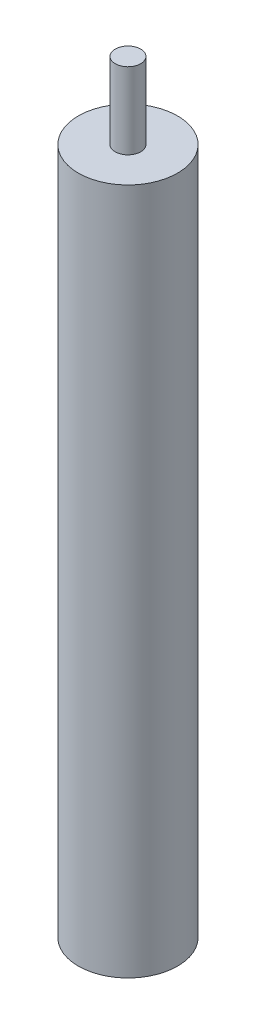
ISO-10303-21;
HEADER;
FILE_DESCRIPTION(('STEP AP214'),'2;1');
FILE_NAME('part.step','',(''),(''),'','','');
FILE_SCHEMA(('AUTOMOTIVE_DESIGN { 1 0 10303 214 1 1 1 1 }'));
ENDSEC;
DATA;
#1=APPLICATION_CONTEXT('core data for automotive mechanical design processes');
#2=APPLICATION_PROTOCOL_DEFINITION('international standard','automotive_design',2000,#1);
#3=PRODUCT_CONTEXT('',#1,'mechanical');
#4=PRODUCT('Part','Part','',(#3));
#5=PRODUCT_RELATED_PRODUCT_CATEGORY('part','',(#4));
#6=PRODUCT_DEFINITION_FORMATION('','',#4);
#7=PRODUCT_DEFINITION_CONTEXT('part definition',#1,'design');
#8=PRODUCT_DEFINITION('design','',#6,#7);
#9=PRODUCT_DEFINITION_SHAPE('','',#8);
#10=(LENGTH_UNIT() NAMED_UNIT(*) SI_UNIT(.MILLI.,.METRE.));
#11=(NAMED_UNIT(*) PLANE_ANGLE_UNIT() SI_UNIT($,.RADIAN.));
#12=(NAMED_UNIT(*) SI_UNIT($,.STERADIAN.) SOLID_ANGLE_UNIT());
#13=UNCERTAINTY_MEASURE_WITH_UNIT(LENGTH_MEASURE(1.E-05),#10,'distance_accuracy_value','');
#14=(GEOMETRIC_REPRESENTATION_CONTEXT(3) GLOBAL_UNCERTAINTY_ASSIGNED_CONTEXT((#13)) GLOBAL_UNIT_ASSIGNED_CONTEXT((#10,
#11,#12)) REPRESENTATION_CONTEXT('',''));
#15=CARTESIAN_POINT('',(0.,0.,0.));
#16=DIRECTION('',(0.,0.,1.));
#17=DIRECTION('',(1.,0.,0.));
#18=AXIS2_PLACEMENT_3D('',#15,#16,#17);
#19=CARTESIAN_POINT('',(-2.94924054111633,27.,-0.333822696480087));
#20=DIRECTION('',(0.,-1.,0.));
#21=DIRECTION('',(0.,0.,-1.));
#22=AXIS2_PLACEMENT_3D('',#19,#20,#21);
#23=CYLINDRICAL_SURFACE('',#22,1.95);
#24=CARTESIAN_POINT('',(-2.94924054111633,27.,-0.333822696480087));
#25=DIRECTION('',(0.,1.,0.));
#26=DIRECTION('',(0.,0.,1.));
#27=AXIS2_PLACEMENT_3D('',#24,#25,#26);
#28=CIRCLE('',#27,1.95);
#29=CARTESIAN_POINT('',(-2.94924054111633,27.,1.61617730351991));
#30=VERTEX_POINT('',#29);
#31=EDGE_CURVE('E38',#30,#30,#28,.T.);
#32=ORIENTED_EDGE('',*,*,#31,.F.);
#33=EDGE_LOOP('',(#32));
#34=FACE_BOUND('',#33,.T.);
#35=CARTESIAN_POINT('',(-2.94924054111633,0.,-0.333822696480087));
#36=DIRECTION('',(0.,1.,0.));
#37=DIRECTION('',(0.,0.,1.));
#38=AXIS2_PLACEMENT_3D('',#35,#36,#37);
#39=CIRCLE('',#38,1.95);
#40=CARTESIAN_POINT('',(-2.94924054111633,0.,1.61617730351991));
#41=VERTEX_POINT('',#40);
#42=EDGE_CURVE('E34',#41,#41,#39,.T.);
#43=ORIENTED_EDGE('',*,*,#42,.T.);
#44=EDGE_LOOP('',(#43));
#45=FACE_BOUND('',#44,.T.);
#46=ADVANCED_FACE('F31',(#34,#45),#23,.T.);
#47=CARTESIAN_POINT('',(-2.94924054111633,27.,-0.333822696480087));
#48=DIRECTION('',(0.,1.,0.));
#49=DIRECTION('',(0.,0.,1.));
#50=AXIS2_PLACEMENT_3D('',#47,#48,#49);
#51=PLANE('',#50);
#52=CARTESIAN_POINT('',(-2.94924054111633,27.,-0.333822696480087));
#53=DIRECTION('',(0.,1.,0.));
#54=DIRECTION('',(0.,0.,1.));
#55=AXIS2_PLACEMENT_3D('',#52,#53,#54);
#56=CIRCLE('',#55,0.5);
#57=CARTESIAN_POINT('',(-2.94924054111633,27.,0.166177303519913));
#58=VERTEX_POINT('',#57);
#59=EDGE_CURVE('E10',#58,#58,#56,.T.);
#60=ORIENTED_EDGE('',*,*,#59,.F.);
#61=EDGE_LOOP('',(#60));
#62=FACE_BOUND('',#61,.T.);
#63=ORIENTED_EDGE('',*,*,#31,.T.);
#64=EDGE_LOOP('',(#63));
#65=FACE_BOUND('',#64,.T.);
#66=ADVANCED_FACE('F55',(#62,#65),#51,.T.);
#67=CARTESIAN_POINT('',(-2.94924054111633,0.,-0.333822696480087));
#68=DIRECTION('',(0.,1.,0.));
#69=DIRECTION('',(0.,0.,1.));
#70=AXIS2_PLACEMENT_3D('',#67,#68,#69);
#71=PLANE('',#70);
#72=ORIENTED_EDGE('',*,*,#42,.F.);
#73=EDGE_LOOP('',(#72));
#74=FACE_BOUND('',#73,.T.);
#75=ADVANCED_FACE('F52',(#74),#71,.F.);
#76=CARTESIAN_POINT('',(-2.94924054111633,30.,-0.333822696480087));
#77=DIRECTION('',(0.,-1.,0.));
#78=DIRECTION('',(0.,0.,-1.));
#79=AXIS2_PLACEMENT_3D('',#76,#77,#78);
#80=CYLINDRICAL_SURFACE('',#79,0.5);
#81=CARTESIAN_POINT('',(-2.94924054111633,30.,-0.333822696480087));
#82=DIRECTION('',(0.,1.,0.));
#83=DIRECTION('',(0.,0.,1.));
#84=AXIS2_PLACEMENT_3D('',#81,#82,#83);
#85=CIRCLE('',#84,0.5);
#86=CARTESIAN_POINT('',(-2.94924054111633,30.,0.166177303519913));
#87=VERTEX_POINT('',#86);
#88=EDGE_CURVE('E44',#87,#87,#85,.T.);
#89=ORIENTED_EDGE('',*,*,#88,.F.);
#90=EDGE_LOOP('',(#89));
#91=FACE_BOUND('',#90,.T.);
#92=ORIENTED_EDGE('',*,*,#59,.T.);
#93=EDGE_LOOP('',(#92));
#94=FACE_BOUND('',#93,.T.);
#95=ADVANCED_FACE('F54',(#91,#94),#80,.T.);
#96=CARTESIAN_POINT('',(-2.94924054111633,30.,-0.333822696480087));
#97=DIRECTION('',(0.,1.,0.));
#98=DIRECTION('',(0.,0.,1.));
#99=AXIS2_PLACEMENT_3D('',#96,#97,#98);
#100=PLANE('',#99);
#101=ORIENTED_EDGE('',*,*,#88,.T.);
#102=EDGE_LOOP('',(#101));
#103=FACE_BOUND('',#102,.T.);
#104=ADVANCED_FACE('F60',(#103),#100,.T.);
#105=CLOSED_SHELL('',(#46,#66,#75,#95,#104));
#106=MANIFOLD_SOLID_BREP('B2',#105);
#107=ADVANCED_BREP_SHAPE_REPRESENTATION('',(#18,#106),#14);
#108=SHAPE_DEFINITION_REPRESENTATION(#9,#107);
ENDSEC;
END-ISO-10303-21;
